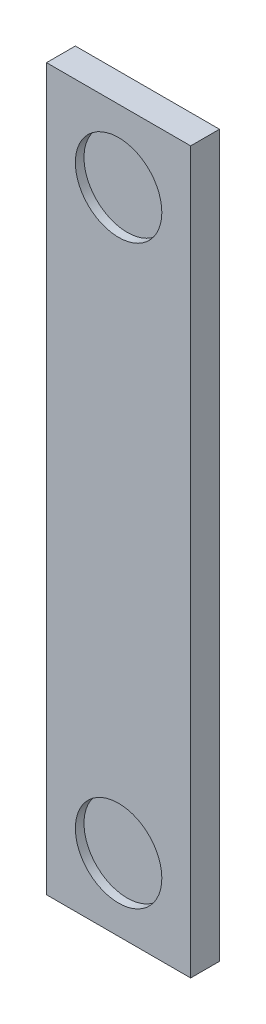
ISO-10303-21;
HEADER;
FILE_DESCRIPTION(('STEP AP214'),'2;1');
FILE_NAME('part.step','',(''),(''),'','','');
FILE_SCHEMA(('AUTOMOTIVE_DESIGN { 1 0 10303 214 1 1 1 1 }'));
ENDSEC;
DATA;
#1=APPLICATION_CONTEXT('core data for automotive mechanical design processes');
#2=APPLICATION_PROTOCOL_DEFINITION('international standard','automotive_design',2000,#1);
#3=PRODUCT_CONTEXT('',#1,'mechanical');
#4=PRODUCT('Part','Part','',(#3));
#5=PRODUCT_RELATED_PRODUCT_CATEGORY('part','',(#4));
#6=PRODUCT_DEFINITION_FORMATION('','',#4);
#7=PRODUCT_DEFINITION_CONTEXT('part definition',#1,'design');
#8=PRODUCT_DEFINITION('design','',#6,#7);
#9=PRODUCT_DEFINITION_SHAPE('','',#8);
#10=(LENGTH_UNIT() NAMED_UNIT(*) SI_UNIT(.MILLI.,.METRE.));
#11=(NAMED_UNIT(*) PLANE_ANGLE_UNIT() SI_UNIT($,.RADIAN.));
#12=(NAMED_UNIT(*) SI_UNIT($,.STERADIAN.) SOLID_ANGLE_UNIT());
#13=UNCERTAINTY_MEASURE_WITH_UNIT(LENGTH_MEASURE(1.E-05),#10,'distance_accuracy_value','');
#14=(GEOMETRIC_REPRESENTATION_CONTEXT(3) GLOBAL_UNCERTAINTY_ASSIGNED_CONTEXT((#13)) GLOBAL_UNIT_ASSIGNED_CONTEXT((#10,
#11,#12)) REPRESENTATION_CONTEXT('',''));
#15=CARTESIAN_POINT('',(0.,0.,0.));
#16=DIRECTION('',(0.,0.,1.));
#17=DIRECTION('',(1.,0.,0.));
#18=AXIS2_PLACEMENT_3D('',#15,#16,#17);
#19=CARTESIAN_POINT('',(25.,125.,5.));
#20=DIRECTION('',(-1.,0.,0.));
#21=DIRECTION('',(0.,-1.,0.));
#22=AXIS2_PLACEMENT_3D('',#19,#20,#21);
#23=PLANE('',#22);
#24=DIRECTION('',(0.,1.,0.));
#25=VECTOR('',#24,1.);
#26=CARTESIAN_POINT('',(25.,125.,-5.));
#27=LINE('',#26,#25);
#28=CARTESIAN_POINT('',(25.,-125.,-5.));
#29=VERTEX_POINT('',#28);
#30=CARTESIAN_POINT('',(25.,125.,-5.));
#31=VERTEX_POINT('',#30);
#32=EDGE_CURVE('E99',#29,#31,#27,.T.);
#33=ORIENTED_EDGE('',*,*,#32,.T.);
#34=DIRECTION('',(0.,0.,-1.));
#35=VECTOR('',#34,1.);
#36=CARTESIAN_POINT('',(25.,125.,5.));
#37=LINE('',#36,#35);
#38=CARTESIAN_POINT('',(25.,125.,5.));
#39=VERTEX_POINT('',#38);
#40=EDGE_CURVE('E11',#39,#31,#37,.T.);
#41=ORIENTED_EDGE('',*,*,#40,.F.);
#42=DIRECTION('',(0.,1.,0.));
#43=VECTOR('',#42,1.);
#44=CARTESIAN_POINT('',(25.,125.,5.));
#45=LINE('',#44,#43);
#46=CARTESIAN_POINT('',(25.,-125.,5.));
#47=VERTEX_POINT('',#46);
#48=EDGE_CURVE('E87',#47,#39,#45,.T.);
#49=ORIENTED_EDGE('',*,*,#48,.F.);
#50=DIRECTION('',(0.,0.,-1.));
#51=VECTOR('',#50,1.);
#52=CARTESIAN_POINT('',(25.,-125.,5.));
#53=LINE('',#52,#51);
#54=EDGE_CURVE('E95',#47,#29,#53,.T.);
#55=ORIENTED_EDGE('',*,*,#54,.T.);
#56=EDGE_LOOP('',(#33,#41,#49,#55));
#57=FACE_BOUND('',#56,.T.);
#58=ADVANCED_FACE('F36',(#57),#23,.F.);
#59=CARTESIAN_POINT('',(-25.,125.,5.));
#60=DIRECTION('',(0.,-1.,0.));
#61=DIRECTION('',(0.,0.,-1.));
#62=AXIS2_PLACEMENT_3D('',#59,#60,#61);
#63=PLANE('',#62);
#64=DIRECTION('',(-1.,0.,0.));
#65=VECTOR('',#64,1.);
#66=CARTESIAN_POINT('',(-25.,125.,-5.));
#67=LINE('',#66,#65);
#68=CARTESIAN_POINT('',(-25.,125.,-5.));
#69=VERTEX_POINT('',#68);
#70=EDGE_CURVE('E91',#31,#69,#67,.T.);
#71=ORIENTED_EDGE('',*,*,#70,.T.);
#72=DIRECTION('',(0.,0.,-1.));
#73=VECTOR('',#72,1.);
#74=CARTESIAN_POINT('',(-25.,125.,5.));
#75=LINE('',#74,#73);
#76=CARTESIAN_POINT('',(-25.,125.,5.));
#77=VERTEX_POINT('',#76);
#78=EDGE_CURVE('E44',#77,#69,#75,.T.);
#79=ORIENTED_EDGE('',*,*,#78,.F.);
#80=DIRECTION('',(-1.,0.,0.));
#81=VECTOR('',#80,1.);
#82=CARTESIAN_POINT('',(-25.,125.,5.));
#83=LINE('',#82,#81);
#84=EDGE_CURVE('E82',#39,#77,#83,.T.);
#85=ORIENTED_EDGE('',*,*,#84,.F.);
#86=ORIENTED_EDGE('',*,*,#40,.T.);
#87=EDGE_LOOP('',(#71,#79,#85,#86));
#88=FACE_BOUND('',#87,.T.);
#89=ADVANCED_FACE('F90',(#88),#63,.F.);
#90=CARTESIAN_POINT('',(-25.,125.,5.));
#91=DIRECTION('',(1.,0.,0.));
#92=DIRECTION('',(0.,1.,0.));
#93=AXIS2_PLACEMENT_3D('',#90,#91,#92);
#94=PLANE('',#93);
#95=DIRECTION('',(0.,-1.,0.));
#96=VECTOR('',#95,1.);
#97=CARTESIAN_POINT('',(-25.,125.,-5.));
#98=LINE('',#97,#96);
#99=CARTESIAN_POINT('',(-25.,-125.,-5.));
#100=VERTEX_POINT('',#99);
#101=EDGE_CURVE('E69',#69,#100,#98,.T.);
#102=ORIENTED_EDGE('',*,*,#101,.T.);
#103=DIRECTION('',(0.,0.,-1.));
#104=VECTOR('',#103,1.);
#105=CARTESIAN_POINT('',(-25.,-125.,5.));
#106=LINE('',#105,#104);
#107=CARTESIAN_POINT('',(-25.,-125.,5.));
#108=VERTEX_POINT('',#107);
#109=EDGE_CURVE('E92',#108,#100,#106,.T.);
#110=ORIENTED_EDGE('',*,*,#109,.F.);
#111=DIRECTION('',(0.,-1.,0.));
#112=VECTOR('',#111,1.);
#113=CARTESIAN_POINT('',(-25.,125.,5.));
#114=LINE('',#113,#112);
#115=EDGE_CURVE('E85',#77,#108,#114,.T.);
#116=ORIENTED_EDGE('',*,*,#115,.F.);
#117=ORIENTED_EDGE('',*,*,#78,.T.);
#118=EDGE_LOOP('',(#102,#110,#116,#117));
#119=FACE_BOUND('',#118,.T.);
#120=ADVANCED_FACE('F93',(#119),#94,.F.);
#121=CARTESIAN_POINT('',(-25.,-125.,5.));
#122=DIRECTION('',(0.,1.,0.));
#123=DIRECTION('',(0.,0.,1.));
#124=AXIS2_PLACEMENT_3D('',#121,#122,#123);
#125=PLANE('',#124);
#126=DIRECTION('',(1.,0.,0.));
#127=VECTOR('',#126,1.);
#128=CARTESIAN_POINT('',(-25.,-125.,-5.));
#129=LINE('',#128,#127);
#130=EDGE_CURVE('E75',#100,#29,#129,.T.);
#131=ORIENTED_EDGE('',*,*,#130,.T.);
#132=ORIENTED_EDGE('',*,*,#54,.F.);
#133=DIRECTION('',(1.,0.,0.));
#134=VECTOR('',#133,1.);
#135=CARTESIAN_POINT('',(-25.,-125.,5.));
#136=LINE('',#135,#134);
#137=EDGE_CURVE('E52',#108,#47,#136,.T.);
#138=ORIENTED_EDGE('',*,*,#137,.F.);
#139=ORIENTED_EDGE('',*,*,#109,.T.);
#140=EDGE_LOOP('',(#131,#132,#138,#139));
#141=FACE_BOUND('',#140,.T.);
#142=ADVANCED_FACE('F107',(#141),#125,.F.);
#143=CARTESIAN_POINT('',(0.,0.,5.));
#144=DIRECTION('',(0.,0.,1.));
#145=DIRECTION('',(1.,0.,0.));
#146=AXIS2_PLACEMENT_3D('',#143,#144,#145);
#147=PLANE('',#146);
#148=CARTESIAN_POINT('',(0.,100.,5.));
#149=DIRECTION('',(0.,0.,1.));
#150=DIRECTION('',(1.,0.,0.));
#151=AXIS2_PLACEMENT_3D('',#148,#149,#150);
#152=CIRCLE('',#151,15.);
#153=CARTESIAN_POINT('',(15.,100.,5.));
#154=VERTEX_POINT('',#153);
#155=EDGE_CURVE('E119',#154,#154,#152,.T.);
#156=ORIENTED_EDGE('',*,*,#155,.F.);
#157=EDGE_LOOP('',(#156));
#158=FACE_BOUND('',#157,.T.);
#159=CARTESIAN_POINT('',(0.,-100.,5.));
#160=DIRECTION('',(0.,0.,1.));
#161=DIRECTION('',(1.,0.,0.));
#162=AXIS2_PLACEMENT_3D('',#159,#160,#161);
#163=CIRCLE('',#162,15.);
#164=CARTESIAN_POINT('',(15.,-100.,5.));
#165=VERTEX_POINT('',#164);
#166=EDGE_CURVE('E113',#165,#165,#163,.T.);
#167=ORIENTED_EDGE('',*,*,#166,.F.);
#168=EDGE_LOOP('',(#167));
#169=FACE_BOUND('',#168,.T.);
#170=ORIENTED_EDGE('',*,*,#48,.T.);
#171=ORIENTED_EDGE('',*,*,#84,.T.);
#172=ORIENTED_EDGE('',*,*,#115,.T.);
#173=ORIENTED_EDGE('',*,*,#137,.T.);
#174=EDGE_LOOP('',(#170,#171,#172,#173));
#175=FACE_BOUND('',#174,.T.);
#176=ADVANCED_FACE('F83',(#158,#169,#175),#147,.T.);
#177=CARTESIAN_POINT('',(0.,0.,-5.));
#178=DIRECTION('',(0.,0.,1.));
#179=DIRECTION('',(1.,0.,0.));
#180=AXIS2_PLACEMENT_3D('',#177,#178,#179);
#181=PLANE('',#180);
#182=ORIENTED_EDGE('',*,*,#32,.F.);
#183=ORIENTED_EDGE('',*,*,#130,.F.);
#184=ORIENTED_EDGE('',*,*,#101,.F.);
#185=ORIENTED_EDGE('',*,*,#70,.F.);
#186=EDGE_LOOP('',(#182,#183,#184,#185));
#187=FACE_BOUND('',#186,.T.);
#188=ADVANCED_FACE('F110',(#187),#181,.F.);
#189=CARTESIAN_POINT('',(0.,-100.,2.));
#190=DIRECTION('',(0.,0.,1.));
#191=DIRECTION('',(1.,0.,0.));
#192=AXIS2_PLACEMENT_3D('',#189,#190,#191);
#193=CYLINDRICAL_SURFACE('',#192,15.);
#194=CARTESIAN_POINT('',(0.,-100.,2.));
#195=DIRECTION('',(0.,0.,1.));
#196=DIRECTION('',(1.,0.,0.));
#197=AXIS2_PLACEMENT_3D('',#194,#195,#196);
#198=CIRCLE('',#197,15.);
#199=CARTESIAN_POINT('',(15.,-100.,2.));
#200=VERTEX_POINT('',#199);
#201=EDGE_CURVE('E116',#200,#200,#198,.T.);
#202=ORIENTED_EDGE('',*,*,#201,.F.);
#203=EDGE_LOOP('',(#202));
#204=FACE_BOUND('',#203,.T.);
#205=ORIENTED_EDGE('',*,*,#166,.T.);
#206=EDGE_LOOP('',(#205));
#207=FACE_BOUND('',#206,.T.);
#208=ADVANCED_FACE('F139',(#204,#207),#193,.F.);
#209=CARTESIAN_POINT('',(0.,-100.,2.));
#210=DIRECTION('',(0.,0.,1.));
#211=DIRECTION('',(1.,0.,0.));
#212=AXIS2_PLACEMENT_3D('',#209,#210,#211);
#213=PLANE('',#212);
#214=ORIENTED_EDGE('',*,*,#201,.T.);
#215=EDGE_LOOP('',(#214));
#216=FACE_BOUND('',#215,.T.);
#217=ADVANCED_FACE('F130',(#216),#213,.T.);
#218=CARTESIAN_POINT('',(0.,100.,2.));
#219=DIRECTION('',(0.,0.,1.));
#220=DIRECTION('',(1.,0.,0.));
#221=AXIS2_PLACEMENT_3D('',#218,#219,#220);
#222=CYLINDRICAL_SURFACE('',#221,15.);
#223=CARTESIAN_POINT('',(0.,100.,2.));
#224=DIRECTION('',(0.,0.,1.));
#225=DIRECTION('',(1.,0.,0.));
#226=AXIS2_PLACEMENT_3D('',#223,#224,#225);
#227=CIRCLE('',#226,15.);
#228=CARTESIAN_POINT('',(15.,100.,2.));
#229=VERTEX_POINT('',#228);
#230=EDGE_CURVE('E102',#229,#229,#227,.T.);
#231=ORIENTED_EDGE('',*,*,#230,.F.);
#232=EDGE_LOOP('',(#231));
#233=FACE_BOUND('',#232,.T.);
#234=ORIENTED_EDGE('',*,*,#155,.T.);
#235=EDGE_LOOP('',(#234));
#236=FACE_BOUND('',#235,.T.);
#237=ADVANCED_FACE('F127',(#233,#236),#222,.F.);
#238=CARTESIAN_POINT('',(0.,100.,2.));
#239=DIRECTION('',(0.,0.,1.));
#240=DIRECTION('',(1.,0.,0.));
#241=AXIS2_PLACEMENT_3D('',#238,#239,#240);
#242=PLANE('',#241);
#243=ORIENTED_EDGE('',*,*,#230,.T.);
#244=EDGE_LOOP('',(#243));
#245=FACE_BOUND('',#244,.T.);
#246=ADVANCED_FACE('F125',(#245),#242,.T.);
#247=CLOSED_SHELL('',(#58,#89,#120,#142,#176,#188,#208,#217,#237,#246));
#248=MANIFOLD_SOLID_BREP('B2',#247);
#249=ADVANCED_BREP_SHAPE_REPRESENTATION('',(#18,#248),#14);
#250=SHAPE_DEFINITION_REPRESENTATION(#9,#249);
ENDSEC;
END-ISO-10303-21;
